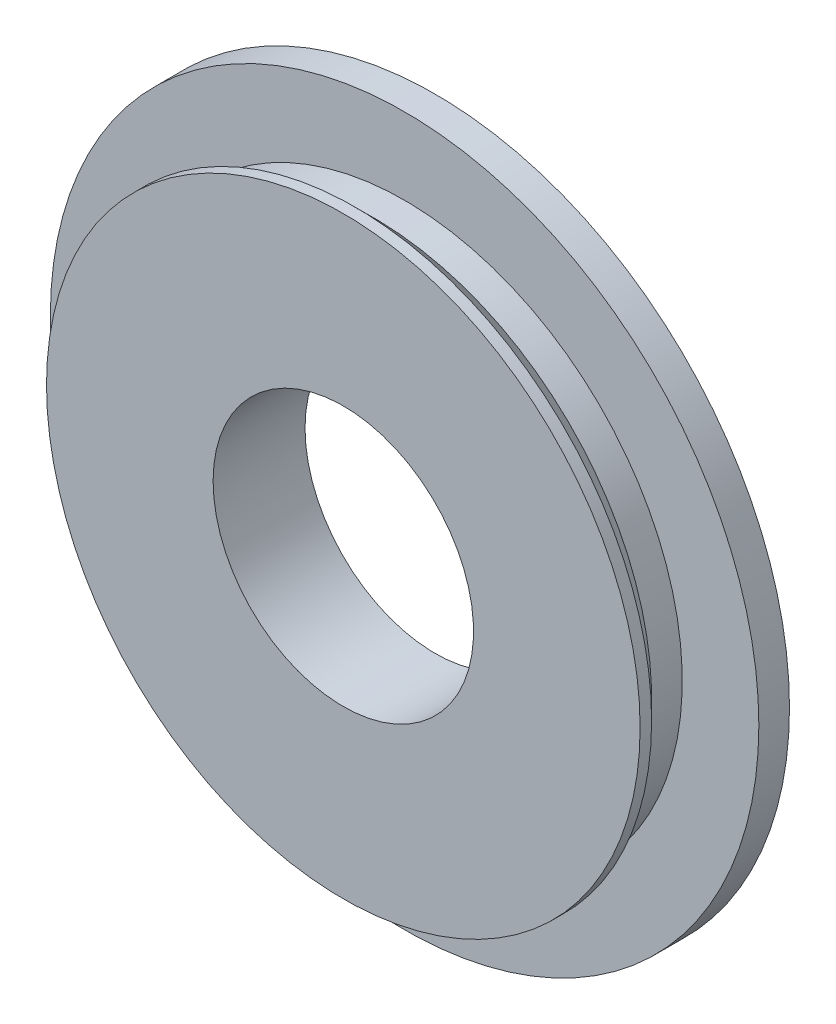
ISO-10303-21;
HEADER;
FILE_DESCRIPTION(('STEP AP214'),'2;1');
FILE_NAME('part.step','',(''),(''),'','','');
FILE_SCHEMA(('AUTOMOTIVE_DESIGN { 1 0 10303 214 1 1 1 1 }'));
ENDSEC;
DATA;
#1=APPLICATION_CONTEXT('core data for automotive mechanical design processes');
#2=APPLICATION_PROTOCOL_DEFINITION('international standard','automotive_design',2000,#1);
#3=PRODUCT_CONTEXT('',#1,'mechanical');
#4=PRODUCT('Part','Part','',(#3));
#5=PRODUCT_RELATED_PRODUCT_CATEGORY('part','',(#4));
#6=PRODUCT_DEFINITION_FORMATION('','',#4);
#7=PRODUCT_DEFINITION_CONTEXT('part definition',#1,'design');
#8=PRODUCT_DEFINITION('design','',#6,#7);
#9=PRODUCT_DEFINITION_SHAPE('','',#8);
#10=(LENGTH_UNIT() NAMED_UNIT(*) SI_UNIT(.MILLI.,.METRE.));
#11=(NAMED_UNIT(*) PLANE_ANGLE_UNIT() SI_UNIT($,.RADIAN.));
#12=(NAMED_UNIT(*) SI_UNIT($,.STERADIAN.) SOLID_ANGLE_UNIT());
#13=UNCERTAINTY_MEASURE_WITH_UNIT(LENGTH_MEASURE(1.E-05),#10,'distance_accuracy_value','');
#14=(GEOMETRIC_REPRESENTATION_CONTEXT(3) GLOBAL_UNCERTAINTY_ASSIGNED_CONTEXT((#13)) GLOBAL_UNIT_ASSIGNED_CONTEXT((#10,
#11,#12)) REPRESENTATION_CONTEXT('',''));
#15=CARTESIAN_POINT('',(0.,0.,0.));
#16=DIRECTION('',(0.,0.,1.));
#17=DIRECTION('',(1.,0.,0.));
#18=AXIS2_PLACEMENT_3D('',#15,#16,#17);
#19=CARTESIAN_POINT('',(0.,0.,-0.0514790503984841));
#20=DIRECTION('',(0.,0.,-1.));
#21=DIRECTION('',(-1.,0.,0.));
#22=AXIS2_PLACEMENT_3D('',#19,#20,#21);
#23=CYLINDRICAL_SURFACE('',#22,3.4);
#24=CARTESIAN_POINT('',(0.,0.,2.4));
#25=DIRECTION('',(0.,0.,-1.));
#26=DIRECTION('',(-1.,0.,0.));
#27=AXIS2_PLACEMENT_3D('',#24,#25,#26);
#28=CIRCLE('',#27,3.4);
#29=CARTESIAN_POINT('',(-3.4,0.,2.4));
#30=VERTEX_POINT('',#29);
#31=EDGE_CURVE('E63',#30,#30,#28,.T.);
#32=ORIENTED_EDGE('',*,*,#31,.F.);
#33=EDGE_LOOP('',(#32));
#34=FACE_BOUND('',#33,.T.);
#35=CARTESIAN_POINT('',(0.,0.,0.));
#36=DIRECTION('',(0.,0.,-1.));
#37=DIRECTION('',(-1.,0.,0.));
#38=AXIS2_PLACEMENT_3D('',#35,#36,#37);
#39=CIRCLE('',#38,3.4);
#40=CARTESIAN_POINT('',(-3.4,0.,0.));
#41=VERTEX_POINT('',#40);
#42=EDGE_CURVE('E10',#41,#41,#39,.T.);
#43=ORIENTED_EDGE('',*,*,#42,.T.);
#44=EDGE_LOOP('',(#43));
#45=FACE_BOUND('',#44,.T.);
#46=ADVANCED_FACE('F35',(#34,#45),#23,.F.);
#47=CARTESIAN_POINT('',(3.4,0.,0.));
#48=DIRECTION('',(0.,0.,1.));
#49=DIRECTION('',(1.,0.,0.));
#50=AXIS2_PLACEMENT_3D('',#47,#48,#49);
#51=PLANE('',#50);
#52=ORIENTED_EDGE('',*,*,#42,.F.);
#53=EDGE_LOOP('',(#52));
#54=FACE_BOUND('',#53,.T.);
#55=CARTESIAN_POINT('',(0.,0.,0.));
#56=DIRECTION('',(0.,0.,-1.));
#57=DIRECTION('',(-1.,0.,0.));
#58=AXIS2_PLACEMENT_3D('',#55,#56,#57);
#59=CIRCLE('',#58,9.25);
#60=CARTESIAN_POINT('',(-9.25,0.,0.));
#61=VERTEX_POINT('',#60);
#62=EDGE_CURVE('E41',#61,#61,#59,.T.);
#63=ORIENTED_EDGE('',*,*,#62,.T.);
#64=EDGE_LOOP('',(#63));
#65=FACE_BOUND('',#64,.T.);
#66=ADVANCED_FACE('F70',(#54,#65),#51,.F.);
#67=CARTESIAN_POINT('',(0.,0.,-0.0514790503984841));
#68=DIRECTION('',(0.,0.,-1.));
#69=DIRECTION('',(-1.,0.,0.));
#70=AXIS2_PLACEMENT_3D('',#67,#68,#69);
#71=CYLINDRICAL_SURFACE('',#70,9.25);
#72=ORIENTED_EDGE('',*,*,#62,.F.);
#73=EDGE_LOOP('',(#72));
#74=FACE_BOUND('',#73,.T.);
#75=CARTESIAN_POINT('',(0.,0.,0.8));
#76=DIRECTION('',(0.,0.,-1.));
#77=DIRECTION('',(-1.,0.,0.));
#78=AXIS2_PLACEMENT_3D('',#75,#76,#77);
#79=CIRCLE('',#78,9.25);
#80=CARTESIAN_POINT('',(-9.25,0.,0.8));
#81=VERTEX_POINT('',#80);
#82=EDGE_CURVE('E45',#81,#81,#79,.T.);
#83=ORIENTED_EDGE('',*,*,#82,.T.);
#84=EDGE_LOOP('',(#83));
#85=FACE_BOUND('',#84,.T.);
#86=ADVANCED_FACE('F74',(#74,#85),#71,.T.);
#87=CARTESIAN_POINT('',(9.25,0.,0.8));
#88=DIRECTION('',(0.,0.,-1.));
#89=DIRECTION('',(-1.,0.,0.));
#90=AXIS2_PLACEMENT_3D('',#87,#88,#89);
#91=PLANE('',#90);
#92=ORIENTED_EDGE('',*,*,#82,.F.);
#93=EDGE_LOOP('',(#92));
#94=FACE_BOUND('',#93,.T.);
#95=CARTESIAN_POINT('',(0.,0.,0.8));
#96=DIRECTION('',(0.,0.,-1.));
#97=DIRECTION('',(-1.,0.,0.));
#98=AXIS2_PLACEMENT_3D('',#95,#96,#97);
#99=CIRCLE('',#98,7.25);
#100=CARTESIAN_POINT('',(-7.25,0.,0.8));
#101=VERTEX_POINT('',#100);
#102=EDGE_CURVE('E49',#101,#101,#99,.T.);
#103=ORIENTED_EDGE('',*,*,#102,.T.);
#104=EDGE_LOOP('',(#103));
#105=FACE_BOUND('',#104,.T.);
#106=ADVANCED_FACE('F79',(#94,#105),#91,.F.);
#107=CARTESIAN_POINT('',(0.,0.,-0.0514790503984841));
#108=DIRECTION('',(0.,0.,-1.));
#109=DIRECTION('',(-1.,0.,0.));
#110=AXIS2_PLACEMENT_3D('',#107,#108,#109);
#111=CYLINDRICAL_SURFACE('',#110,7.25);
#112=ORIENTED_EDGE('',*,*,#102,.F.);
#113=EDGE_LOOP('',(#112));
#114=FACE_BOUND('',#113,.T.);
#115=CARTESIAN_POINT('',(0.,0.,1.6));
#116=DIRECTION('',(0.,0.,-1.));
#117=DIRECTION('',(-1.,0.,0.));
#118=AXIS2_PLACEMENT_3D('',#115,#116,#117);
#119=CIRCLE('',#118,7.25);
#120=CARTESIAN_POINT('',(-7.25,0.,1.6));
#121=VERTEX_POINT('',#120);
#122=EDGE_CURVE('E54',#121,#121,#119,.T.);
#123=ORIENTED_EDGE('',*,*,#122,.T.);
#124=EDGE_LOOP('',(#123));
#125=FACE_BOUND('',#124,.T.);
#126=ADVANCED_FACE('F85',(#114,#125),#111,.T.);
#127=CARTESIAN_POINT('',(0.,0.,2.1));
#128=DIRECTION('',(0.,0.,1.));
#129=DIRECTION('',(1.,0.,0.));
#130=AXIS2_PLACEMENT_3D('',#127,#128,#129);
#131=CONICAL_SURFACE('',#130,7.75,0.78539816339745);
#132=ORIENTED_EDGE('',*,*,#122,.F.);
#133=EDGE_LOOP('',(#132));
#134=FACE_BOUND('',#133,.T.);
#135=CARTESIAN_POINT('',(0.,0.,2.1));
#136=DIRECTION('',(0.,0.,-1.));
#137=DIRECTION('',(-1.,0.,0.));
#138=AXIS2_PLACEMENT_3D('',#135,#136,#137);
#139=CIRCLE('',#138,7.75);
#140=CARTESIAN_POINT('',(-7.75,0.,2.1));
#141=VERTEX_POINT('',#140);
#142=EDGE_CURVE('E57',#141,#141,#139,.T.);
#143=ORIENTED_EDGE('',*,*,#142,.T.);
#144=EDGE_LOOP('',(#143));
#145=FACE_BOUND('',#144,.T.);
#146=ADVANCED_FACE('F89',(#134,#145),#131,.T.);
#147=CARTESIAN_POINT('',(0.,0.,-0.0514790503984841));
#148=DIRECTION('',(0.,0.,-1.));
#149=DIRECTION('',(-1.,0.,0.));
#150=AXIS2_PLACEMENT_3D('',#147,#148,#149);
#151=CYLINDRICAL_SURFACE('',#150,7.75);
#152=ORIENTED_EDGE('',*,*,#142,.F.);
#153=EDGE_LOOP('',(#152));
#154=FACE_BOUND('',#153,.T.);
#155=CARTESIAN_POINT('',(0.,0.,2.4));
#156=DIRECTION('',(0.,0.,-1.));
#157=DIRECTION('',(-1.,0.,0.));
#158=AXIS2_PLACEMENT_3D('',#155,#156,#157);
#159=CIRCLE('',#158,7.75);
#160=CARTESIAN_POINT('',(-7.75,0.,2.4));
#161=VERTEX_POINT('',#160);
#162=EDGE_CURVE('E60',#161,#161,#159,.T.);
#163=ORIENTED_EDGE('',*,*,#162,.T.);
#164=EDGE_LOOP('',(#163));
#165=FACE_BOUND('',#164,.T.);
#166=ADVANCED_FACE('F93',(#154,#165),#151,.T.);
#167=CARTESIAN_POINT('',(7.75,0.,2.4));
#168=DIRECTION('',(0.,0.,-1.));
#169=DIRECTION('',(-1.,0.,0.));
#170=AXIS2_PLACEMENT_3D('',#167,#168,#169);
#171=PLANE('',#170);
#172=ORIENTED_EDGE('',*,*,#162,.F.);
#173=EDGE_LOOP('',(#172));
#174=FACE_BOUND('',#173,.T.);
#175=ORIENTED_EDGE('',*,*,#31,.T.);
#176=EDGE_LOOP('',(#175));
#177=FACE_BOUND('',#176,.T.);
#178=ADVANCED_FACE('F67',(#174,#177),#171,.F.);
#179=CLOSED_SHELL('',(#46,#66,#86,#106,#126,#146,#166,#178));
#180=MANIFOLD_SOLID_BREP('B2',#179);
#181=ADVANCED_BREP_SHAPE_REPRESENTATION('',(#18,#180),#14);
#182=SHAPE_DEFINITION_REPRESENTATION(#9,#181);
ENDSEC;
END-ISO-10303-21;
